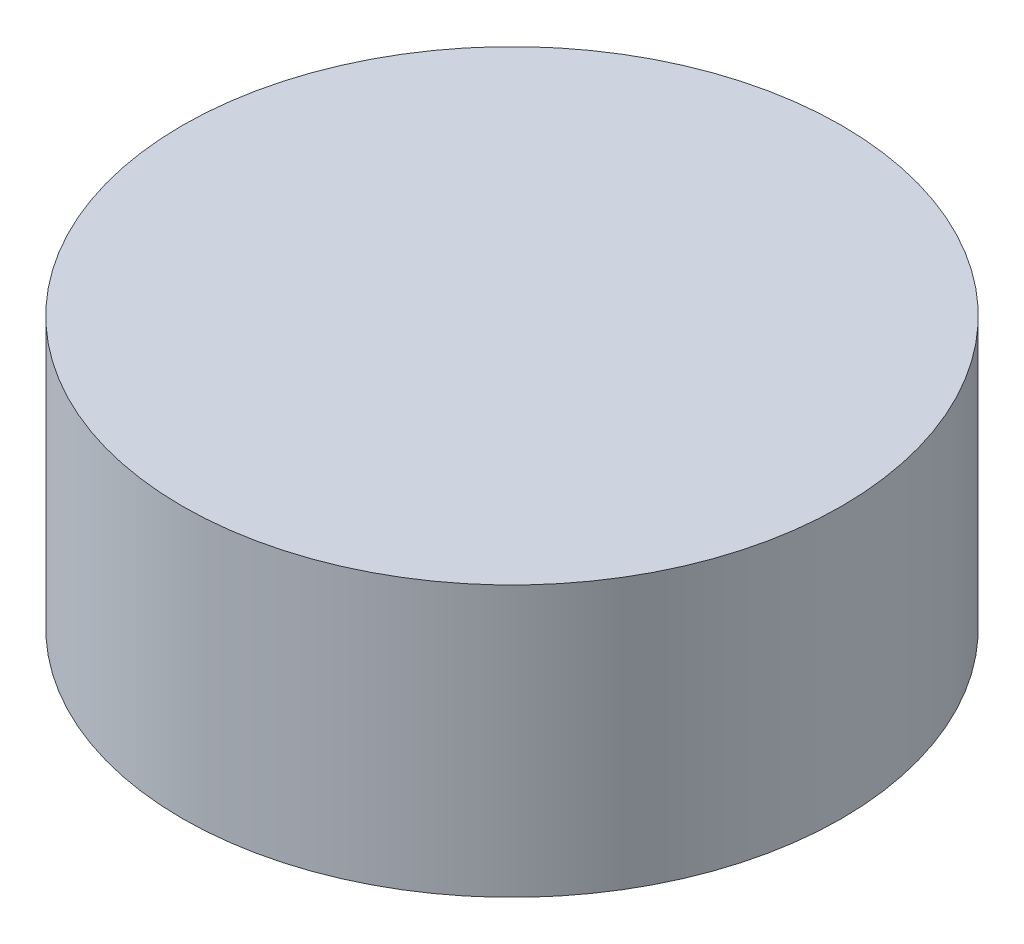
ISO-10303-21;
HEADER;
FILE_DESCRIPTION(('STEP AP214'),'2;1');
FILE_NAME('part.step','',(''),(''),'','','');
FILE_SCHEMA(('AUTOMOTIVE_DESIGN { 1 0 10303 214 1 1 1 1 }'));
ENDSEC;
DATA;
#1=APPLICATION_CONTEXT('core data for automotive mechanical design processes');
#2=APPLICATION_PROTOCOL_DEFINITION('international standard','automotive_design',2000,#1);
#3=PRODUCT_CONTEXT('',#1,'mechanical');
#4=PRODUCT('Part','Part','',(#3));
#5=PRODUCT_RELATED_PRODUCT_CATEGORY('part','',(#4));
#6=PRODUCT_DEFINITION_FORMATION('','',#4);
#7=PRODUCT_DEFINITION_CONTEXT('part definition',#1,'design');
#8=PRODUCT_DEFINITION('design','',#6,#7);
#9=PRODUCT_DEFINITION_SHAPE('','',#8);
#10=(LENGTH_UNIT() NAMED_UNIT(*) SI_UNIT(.MILLI.,.METRE.));
#11=(NAMED_UNIT(*) PLANE_ANGLE_UNIT() SI_UNIT($,.RADIAN.));
#12=(NAMED_UNIT(*) SI_UNIT($,.STERADIAN.) SOLID_ANGLE_UNIT());
#13=UNCERTAINTY_MEASURE_WITH_UNIT(LENGTH_MEASURE(1.E-05),#10,'distance_accuracy_value','');
#14=(GEOMETRIC_REPRESENTATION_CONTEXT(3) GLOBAL_UNCERTAINTY_ASSIGNED_CONTEXT((#13)) GLOBAL_UNIT_ASSIGNED_CONTEXT((#10,
#11,#12)) REPRESENTATION_CONTEXT('',''));
#15=CARTESIAN_POINT('',(0.,0.,0.));
#16=DIRECTION('',(0.,0.,1.));
#17=DIRECTION('',(1.,0.,0.));
#18=AXIS2_PLACEMENT_3D('',#15,#16,#17);
#19=CARTESIAN_POINT('',(3.9,-3.2,-3.9));
#20=DIRECTION('',(0.,1.,0.));
#21=DIRECTION('',(0.,0.,1.));
#22=AXIS2_PLACEMENT_3D('',#19,#20,#21);
#23=CYLINDRICAL_SURFACE('',#22,3.9);
#24=CARTESIAN_POINT('',(3.9,-3.2,-3.9));
#25=DIRECTION('',(0.,1.,0.));
#26=DIRECTION('',(0.,0.,1.));
#27=AXIS2_PLACEMENT_3D('',#24,#25,#26);
#28=CIRCLE('',#27,3.9);
#29=CARTESIAN_POINT('',(3.9,-3.2,0.));
#30=VERTEX_POINT('',#29);
#31=EDGE_CURVE('E10',#30,#30,#28,.T.);
#32=ORIENTED_EDGE('',*,*,#31,.T.);
#33=EDGE_LOOP('',(#32));
#34=FACE_BOUND('',#33,.T.);
#35=CARTESIAN_POINT('',(3.9,0.,-3.9));
#36=DIRECTION('',(0.,1.,0.));
#37=DIRECTION('',(0.,0.,1.));
#38=AXIS2_PLACEMENT_3D('',#35,#36,#37);
#39=CIRCLE('',#38,3.9);
#40=CARTESIAN_POINT('',(3.9,0.,0.));
#41=VERTEX_POINT('',#40);
#42=EDGE_CURVE('E40',#41,#41,#39,.T.);
#43=ORIENTED_EDGE('',*,*,#42,.F.);
#44=EDGE_LOOP('',(#43));
#45=FACE_BOUND('',#44,.T.);
#46=ADVANCED_FACE('F37',(#34,#45),#23,.T.);
#47=CARTESIAN_POINT('',(3.9,-3.2,-3.9));
#48=DIRECTION('',(0.,1.,0.));
#49=DIRECTION('',(0.,0.,1.));
#50=AXIS2_PLACEMENT_3D('',#47,#48,#49);
#51=PLANE('',#50);
#52=CARTESIAN_POINT('',(3.9,-3.2,-3.9));
#53=DIRECTION('',(0.,1.,0.));
#54=DIRECTION('',(0.,0.,1.));
#55=AXIS2_PLACEMENT_3D('',#52,#53,#54);
#56=CIRCLE('',#55,2.6);
#57=CARTESIAN_POINT('',(3.9,-3.2,-1.3));
#58=VERTEX_POINT('',#57);
#59=EDGE_CURVE('E49',#58,#58,#56,.T.);
#60=ORIENTED_EDGE('',*,*,#59,.T.);
#61=EDGE_LOOP('',(#60));
#62=FACE_BOUND('',#61,.T.);
#63=ORIENTED_EDGE('',*,*,#31,.F.);
#64=EDGE_LOOP('',(#63));
#65=FACE_BOUND('',#64,.T.);
#66=ADVANCED_FACE('F72',(#62,#65),#51,.F.);
#67=CARTESIAN_POINT('',(3.9,0.,-3.9));
#68=DIRECTION('',(0.,1.,0.));
#69=DIRECTION('',(0.,0.,1.));
#70=AXIS2_PLACEMENT_3D('',#67,#68,#69);
#71=PLANE('',#70);
#72=ORIENTED_EDGE('',*,*,#42,.T.);
#73=EDGE_LOOP('',(#72));
#74=FACE_BOUND('',#73,.T.);
#75=ADVANCED_FACE('F67',(#74),#71,.T.);
#76=CARTESIAN_POINT('',(3.9,-3.2,-3.9));
#77=DIRECTION('',(0.,1.,0.));
#78=DIRECTION('',(0.,0.,1.));
#79=AXIS2_PLACEMENT_3D('',#76,#77,#78);
#80=CYLINDRICAL_SURFACE('',#79,2.6);
#81=ORIENTED_EDGE('',*,*,#59,.F.);
#82=EDGE_LOOP('',(#81));
#83=FACE_BOUND('',#82,.T.);
#84=CARTESIAN_POINT('',(3.9,-1.3,-3.9));
#85=DIRECTION('',(0.,1.,0.));
#86=DIRECTION('',(0.,0.,1.));
#87=AXIS2_PLACEMENT_3D('',#84,#85,#86);
#88=CIRCLE('',#87,2.6);
#89=CARTESIAN_POINT('',(3.9,-1.3,-1.3));
#90=VERTEX_POINT('',#89);
#91=EDGE_CURVE('E54',#90,#90,#88,.T.);
#92=ORIENTED_EDGE('',*,*,#91,.T.);
#93=EDGE_LOOP('',(#92));
#94=FACE_BOUND('',#93,.T.);
#95=ADVANCED_FACE('F59',(#83,#94),#80,.F.);
#96=CARTESIAN_POINT('',(3.9,-1.3,-3.9));
#97=DIRECTION('',(0.,1.,0.));
#98=DIRECTION('',(0.,0.,1.));
#99=AXIS2_PLACEMENT_3D('',#96,#97,#98);
#100=PLANE('',#99);
#101=ORIENTED_EDGE('',*,*,#91,.F.);
#102=EDGE_LOOP('',(#101));
#103=FACE_BOUND('',#102,.T.);
#104=ADVANCED_FACE('F61',(#103),#100,.F.);
#105=CLOSED_SHELL('',(#46,#66,#75,#95,#104));
#106=MANIFOLD_SOLID_BREP('B2',#105);
#107=ADVANCED_BREP_SHAPE_REPRESENTATION('',(#18,#106),#14);
#108=SHAPE_DEFINITION_REPRESENTATION(#9,#107);
ENDSEC;
END-ISO-10303-21;
